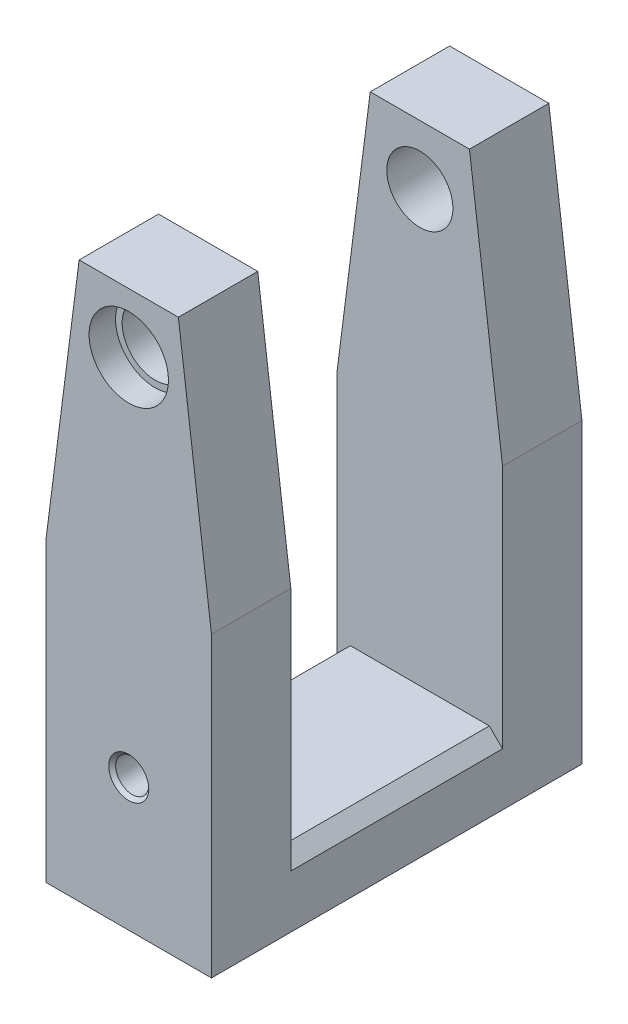
ISO-10303-21;
HEADER;
FILE_DESCRIPTION(('STEP AP214'),'2;1');
FILE_NAME('part.step','',(''),(''),'','','');
FILE_SCHEMA(('AUTOMOTIVE_DESIGN { 1 0 10303 214 1 1 1 1 }'));
ENDSEC;
DATA;
#1=APPLICATION_CONTEXT('core data for automotive mechanical design processes');
#2=APPLICATION_PROTOCOL_DEFINITION('international standard','automotive_design',2000,#1);
#3=PRODUCT_CONTEXT('',#1,'mechanical');
#4=PRODUCT('Part','Part','',(#3));
#5=PRODUCT_RELATED_PRODUCT_CATEGORY('part','',(#4));
#6=PRODUCT_DEFINITION_FORMATION('','',#4);
#7=PRODUCT_DEFINITION_CONTEXT('part definition',#1,'design');
#8=PRODUCT_DEFINITION('design','',#6,#7);
#9=PRODUCT_DEFINITION_SHAPE('','',#8);
#10=(LENGTH_UNIT() NAMED_UNIT(*) SI_UNIT(.MILLI.,.METRE.));
#11=(NAMED_UNIT(*) PLANE_ANGLE_UNIT() SI_UNIT($,.RADIAN.));
#12=(NAMED_UNIT(*) SI_UNIT($,.STERADIAN.) SOLID_ANGLE_UNIT());
#13=UNCERTAINTY_MEASURE_WITH_UNIT(LENGTH_MEASURE(1.E-05),#10,'distance_accuracy_value','');
#14=(GEOMETRIC_REPRESENTATION_CONTEXT(3) GLOBAL_UNCERTAINTY_ASSIGNED_CONTEXT((#13)) GLOBAL_UNIT_ASSIGNED_CONTEXT((#10,
#11,#12)) REPRESENTATION_CONTEXT('',''));
#15=CARTESIAN_POINT('',(0.,0.,0.));
#16=DIRECTION('',(0.,0.,1.));
#17=DIRECTION('',(1.,0.,0.));
#18=AXIS2_PLACEMENT_3D('',#15,#16,#17);
#19=CARTESIAN_POINT('',(12.5,3.,28.));
#20=DIRECTION('',(-0.991881664685851,-0.127164315985366,0.));
#21=DIRECTION('',(0.127164315985366,-0.991881664685851,0.));
#22=AXIS2_PLACEMENT_3D('',#19,#20,#21);
#23=PLANE('',#22);
#24=DIRECTION('',(0.,0.,-1.));
#25=VECTOR('',#24,1.);
#26=CARTESIAN_POINT('',(7.49999999999999,42.,28.));
#27=LINE('',#26,#25);
#28=CARTESIAN_POINT('',(7.5,42.,-16.));
#29=VERTEX_POINT('',#28);
#30=CARTESIAN_POINT('',(7.49999999999999,42.,-28.));
#31=VERTEX_POINT('',#30);
#32=EDGE_CURVE('E176',#29,#31,#27,.T.);
#33=ORIENTED_EDGE('',*,*,#32,.F.);
#34=DIRECTION('',(0.127164315985366,-0.991881664685851,0.));
#35=VECTOR('',#34,1.);
#36=CARTESIAN_POINT('',(12.5,3.00000000000001,-16.));
#37=LINE('',#36,#35);
#38=CARTESIAN_POINT('',(12.5,3.,-16.));
#39=VERTEX_POINT('',#38);
#40=EDGE_CURVE('E233',#29,#39,#37,.T.);
#41=ORIENTED_EDGE('',*,*,#40,.T.);
#42=DIRECTION('',(0.,0.,-1.));
#43=VECTOR('',#42,1.);
#44=CARTESIAN_POINT('',(12.5,3.,28.));
#45=LINE('',#44,#43);
#46=CARTESIAN_POINT('',(12.5,3.,-28.));
#47=VERTEX_POINT('',#46);
#48=EDGE_CURVE('E184',#39,#47,#45,.T.);
#49=ORIENTED_EDGE('',*,*,#48,.T.);
#50=DIRECTION('',(-0.127164315985366,0.99188166468585,0.));
#51=VECTOR('',#50,1.);
#52=CARTESIAN_POINT('',(12.5,3.,-28.));
#53=LINE('',#52,#51);
#54=EDGE_CURVE('E253',#47,#31,#53,.T.);
#55=ORIENTED_EDGE('',*,*,#54,.T.);
#56=EDGE_LOOP('',(#33,#41,#49,#55));
#57=FACE_BOUND('',#56,.T.);
#58=ADVANCED_FACE('F46',(#57),#23,.F.);
#59=CARTESIAN_POINT('',(-7.50000000000001,42.,28.));
#60=DIRECTION('',(0.,-1.,0.));
#61=DIRECTION('',(0.,0.,-1.));
#62=AXIS2_PLACEMENT_3D('',#59,#60,#61);
#63=PLANE('',#62);
#64=DIRECTION('',(0.,0.,-1.));
#65=VECTOR('',#64,1.);
#66=CARTESIAN_POINT('',(-7.50000000000001,42.,28.));
#67=LINE('',#66,#65);
#68=CARTESIAN_POINT('',(-7.5,42.,-16.));
#69=VERTEX_POINT('',#68);
#70=CARTESIAN_POINT('',(-7.50000000000001,42.,-28.));
#71=VERTEX_POINT('',#70);
#72=EDGE_CURVE('E177',#69,#71,#67,.T.);
#73=ORIENTED_EDGE('',*,*,#72,.F.);
#74=DIRECTION('',(1.,0.,0.));
#75=VECTOR('',#74,1.);
#76=CARTESIAN_POINT('',(-28.,42.,-16.));
#77=LINE('',#76,#75);
#78=EDGE_CURVE('E172',#69,#29,#77,.T.);
#79=ORIENTED_EDGE('',*,*,#78,.T.);
#80=ORIENTED_EDGE('',*,*,#32,.T.);
#81=DIRECTION('',(-1.,0.,0.));
#82=VECTOR('',#81,1.);
#83=CARTESIAN_POINT('',(-7.50000000000001,42.,-28.));
#84=LINE('',#83,#82);
#85=EDGE_CURVE('E256',#31,#71,#84,.T.);
#86=ORIENTED_EDGE('',*,*,#85,.T.);
#87=EDGE_LOOP('',(#73,#79,#80,#86));
#88=FACE_BOUND('',#87,.T.);
#89=ADVANCED_FACE('F296',(#88),#63,.F.);
#90=CARTESIAN_POINT('',(-12.5,3.,28.));
#91=DIRECTION('',(0.991881664685851,-0.127164315985365,0.));
#92=DIRECTION('',(0.127164315985365,0.991881664685851,0.));
#93=AXIS2_PLACEMENT_3D('',#90,#91,#92);
#94=PLANE('',#93);
#95=DIRECTION('',(0.,0.,-1.));
#96=VECTOR('',#95,1.);
#97=CARTESIAN_POINT('',(-12.5,3.,28.));
#98=LINE('',#97,#96);
#99=CARTESIAN_POINT('',(-12.5,3.,-16.));
#100=VERTEX_POINT('',#99);
#101=CARTESIAN_POINT('',(-12.5,3.,-28.));
#102=VERTEX_POINT('',#101);
#103=EDGE_CURVE('E268',#100,#102,#98,.T.);
#104=ORIENTED_EDGE('',*,*,#103,.F.);
#105=DIRECTION('',(0.127164315985365,0.991881664685851,0.));
#106=VECTOR('',#105,1.);
#107=CARTESIAN_POINT('',(-12.5,3.00000000000001,-16.));
#108=LINE('',#107,#106);
#109=EDGE_CURVE('E230',#100,#69,#108,.T.);
#110=ORIENTED_EDGE('',*,*,#109,.T.);
#111=ORIENTED_EDGE('',*,*,#72,.T.);
#112=DIRECTION('',(-0.127164315985365,-0.99188166468585,0.));
#113=VECTOR('',#112,1.);
#114=CARTESIAN_POINT('',(-12.5,3.,-28.));
#115=LINE('',#114,#113);
#116=EDGE_CURVE('E259',#71,#102,#115,.T.);
#117=ORIENTED_EDGE('',*,*,#116,.T.);
#118=EDGE_LOOP('',(#104,#110,#111,#117));
#119=FACE_BOUND('',#118,.T.);
#120=ADVANCED_FACE('F298',(#119),#94,.F.);
#121=CARTESIAN_POINT('',(12.5,3.,28.));
#122=DIRECTION('',(-1.,0.,0.));
#123=DIRECTION('',(0.,-1.,0.));
#124=AXIS2_PLACEMENT_3D('',#121,#122,#123);
#125=PLANE('',#124);
#126=DIRECTION('',(0.,0.,1.));
#127=VECTOR('',#126,1.);
#128=CARTESIAN_POINT('',(12.5,-34.,28.));
#129=LINE('',#128,#127);
#130=CARTESIAN_POINT('',(12.5,-34.,-16.));
#131=VERTEX_POINT('',#130);
#132=CARTESIAN_POINT('',(12.5,-34.,16.));
#133=VERTEX_POINT('',#132);
#134=EDGE_CURVE('E199',#131,#133,#129,.T.);
#135=ORIENTED_EDGE('',*,*,#134,.T.);
#136=DIRECTION('',(0.,1.,0.));
#137=VECTOR('',#136,1.);
#138=CARTESIAN_POINT('',(12.5,3.,16.));
#139=LINE('',#138,#137);
#140=CARTESIAN_POINT('',(12.5,3.,16.));
#141=VERTEX_POINT('',#140);
#142=EDGE_CURVE('E63',#133,#141,#139,.T.);
#143=ORIENTED_EDGE('',*,*,#142,.T.);
#144=CARTESIAN_POINT('',(12.5,3.,28.));
#145=VERTEX_POINT('',#144);
#146=EDGE_CURVE('E185',#145,#141,#45,.T.);
#147=ORIENTED_EDGE('',*,*,#146,.F.);
#148=DIRECTION('',(0.,1.,0.));
#149=VECTOR('',#148,1.);
#150=CARTESIAN_POINT('',(12.5,3.,28.));
#151=LINE('',#150,#149);
#152=CARTESIAN_POINT('',(12.5,-42.,28.));
#153=VERTEX_POINT('',#152);
#154=EDGE_CURVE('E237',#153,#145,#151,.T.);
#155=ORIENTED_EDGE('',*,*,#154,.F.);
#156=DIRECTION('',(0.,0.,-1.));
#157=VECTOR('',#156,1.);
#158=CARTESIAN_POINT('',(12.5,-42.,28.));
#159=LINE('',#158,#157);
#160=CARTESIAN_POINT('',(12.5,-42.,-28.));
#161=VERTEX_POINT('',#160);
#162=EDGE_CURVE('E250',#153,#161,#159,.T.);
#163=ORIENTED_EDGE('',*,*,#162,.T.);
#164=DIRECTION('',(0.,1.,0.));
#165=VECTOR('',#164,1.);
#166=CARTESIAN_POINT('',(12.5,3.,-28.));
#167=LINE('',#166,#165);
#168=EDGE_CURVE('E236',#161,#47,#167,.T.);
#169=ORIENTED_EDGE('',*,*,#168,.T.);
#170=ORIENTED_EDGE('',*,*,#48,.F.);
#171=DIRECTION('',(0.,-1.,0.));
#172=VECTOR('',#171,1.);
#173=CARTESIAN_POINT('',(12.5,3.00000000000001,-16.));
#174=LINE('',#173,#172);
#175=EDGE_CURVE('E71',#39,#131,#174,.T.);
#176=ORIENTED_EDGE('',*,*,#175,.T.);
#177=EDGE_LOOP('',(#135,#143,#147,#155,#163,#169,#170,#176));
#178=FACE_BOUND('',#177,.T.);
#179=ADVANCED_FACE('F284',(#178),#125,.F.);
#180=ORIENTED_EDGE('',*,*,#146,.T.);
#181=DIRECTION('',(-0.127164315985366,0.991881664685851,0.));
#182=VECTOR('',#181,1.);
#183=CARTESIAN_POINT('',(12.5,3.,16.));
#184=LINE('',#183,#182);
#185=CARTESIAN_POINT('',(7.5,42.,16.));
#186=VERTEX_POINT('',#185);
#187=EDGE_CURVE('E159',#141,#186,#184,.T.);
#188=ORIENTED_EDGE('',*,*,#187,.T.);
#189=CARTESIAN_POINT('',(7.49999999999999,42.,28.));
#190=VERTEX_POINT('',#189);
#191=EDGE_CURVE('E170',#190,#186,#27,.T.);
#192=ORIENTED_EDGE('',*,*,#191,.F.);
#193=DIRECTION('',(-0.127164315985366,0.99188166468585,0.));
#194=VECTOR('',#193,1.);
#195=CARTESIAN_POINT('',(12.5,3.,28.));
#196=LINE('',#195,#194);
#197=EDGE_CURVE('E240',#145,#190,#196,.T.);
#198=ORIENTED_EDGE('',*,*,#197,.F.);
#199=EDGE_LOOP('',(#180,#188,#192,#198));
#200=FACE_BOUND('',#199,.T.);
#201=ADVANCED_FACE('F283',(#200),#23,.F.);
#202=ORIENTED_EDGE('',*,*,#191,.T.);
#203=DIRECTION('',(1.,0.,0.));
#204=VECTOR('',#203,1.);
#205=CARTESIAN_POINT('',(-28.,42.,16.));
#206=LINE('',#205,#204);
#207=CARTESIAN_POINT('',(-7.5,42.,16.));
#208=VERTEX_POINT('',#207);
#209=EDGE_CURVE('E151',#208,#186,#206,.T.);
#210=ORIENTED_EDGE('',*,*,#209,.F.);
#211=CARTESIAN_POINT('',(-7.50000000000001,42.,28.));
#212=VERTEX_POINT('',#211);
#213=EDGE_CURVE('E167',#212,#208,#67,.T.);
#214=ORIENTED_EDGE('',*,*,#213,.F.);
#215=DIRECTION('',(-1.,0.,0.));
#216=VECTOR('',#215,1.);
#217=CARTESIAN_POINT('',(-7.50000000000001,42.,28.));
#218=LINE('',#217,#216);
#219=EDGE_CURVE('E243',#190,#212,#218,.T.);
#220=ORIENTED_EDGE('',*,*,#219,.F.);
#221=EDGE_LOOP('',(#202,#210,#214,#220));
#222=FACE_BOUND('',#221,.T.);
#223=ADVANCED_FACE('F165',(#222),#63,.F.);
#224=ORIENTED_EDGE('',*,*,#213,.T.);
#225=DIRECTION('',(-0.127164315985365,-0.991881664685851,0.));
#226=VECTOR('',#225,1.);
#227=CARTESIAN_POINT('',(-12.5,3.,16.));
#228=LINE('',#227,#226);
#229=CARTESIAN_POINT('',(-12.5,3.,16.));
#230=VERTEX_POINT('',#229);
#231=EDGE_CURVE('E147',#208,#230,#228,.T.);
#232=ORIENTED_EDGE('',*,*,#231,.T.);
#233=CARTESIAN_POINT('',(-12.5,3.,28.));
#234=VERTEX_POINT('',#233);
#235=EDGE_CURVE('E180',#234,#230,#98,.T.);
#236=ORIENTED_EDGE('',*,*,#235,.F.);
#237=DIRECTION('',(-0.127164315985365,-0.99188166468585,0.));
#238=VECTOR('',#237,1.);
#239=CARTESIAN_POINT('',(-12.5,3.,28.));
#240=LINE('',#239,#238);
#241=EDGE_CURVE('E175',#212,#234,#240,.T.);
#242=ORIENTED_EDGE('',*,*,#241,.F.);
#243=EDGE_LOOP('',(#224,#232,#236,#242));
#244=FACE_BOUND('',#243,.T.);
#245=ADVANCED_FACE('F174',(#244),#94,.F.);
#246=CARTESIAN_POINT('',(-12.5,3.,28.));
#247=DIRECTION('',(1.,0.,0.));
#248=DIRECTION('',(0.,1.,0.));
#249=AXIS2_PLACEMENT_3D('',#246,#247,#248);
#250=PLANE('',#249);
#251=DIRECTION('',(0.,0.,-1.));
#252=VECTOR('',#251,1.);
#253=CARTESIAN_POINT('',(-12.5,-34.,28.));
#254=LINE('',#253,#252);
#255=CARTESIAN_POINT('',(-12.5,-34.,16.));
#256=VERTEX_POINT('',#255);
#257=CARTESIAN_POINT('',(-12.5,-34.,-16.));
#258=VERTEX_POINT('',#257);
#259=EDGE_CURVE('E192',#256,#258,#254,.T.);
#260=ORIENTED_EDGE('',*,*,#259,.T.);
#261=DIRECTION('',(0.,1.,0.));
#262=VECTOR('',#261,1.);
#263=CARTESIAN_POINT('',(-12.5,3.00000000000001,-16.));
#264=LINE('',#263,#262);
#265=EDGE_CURVE('E189',#258,#100,#264,.T.);
#266=ORIENTED_EDGE('',*,*,#265,.T.);
#267=ORIENTED_EDGE('',*,*,#103,.T.);
#268=DIRECTION('',(0.,-1.,0.));
#269=VECTOR('',#268,1.);
#270=CARTESIAN_POINT('',(-12.5,3.,-28.));
#271=LINE('',#270,#269);
#272=CARTESIAN_POINT('',(-12.5,-42.,-28.));
#273=VERTEX_POINT('',#272);
#274=EDGE_CURVE('E262',#102,#273,#271,.T.);
#275=ORIENTED_EDGE('',*,*,#274,.T.);
#276=DIRECTION('',(0.,0.,-1.));
#277=VECTOR('',#276,1.);
#278=CARTESIAN_POINT('',(-12.5,-42.,28.));
#279=LINE('',#278,#277);
#280=CARTESIAN_POINT('',(-12.5,-42.,28.));
#281=VERTEX_POINT('',#280);
#282=EDGE_CURVE('E266',#281,#273,#279,.T.);
#283=ORIENTED_EDGE('',*,*,#282,.F.);
#284=DIRECTION('',(0.,-1.,0.));
#285=VECTOR('',#284,1.);
#286=CARTESIAN_POINT('',(-12.5,3.,28.));
#287=LINE('',#286,#285);
#288=EDGE_CURVE('E246',#234,#281,#287,.T.);
#289=ORIENTED_EDGE('',*,*,#288,.F.);
#290=ORIENTED_EDGE('',*,*,#235,.T.);
#291=DIRECTION('',(0.,-1.,0.));
#292=VECTOR('',#291,1.);
#293=CARTESIAN_POINT('',(-12.5,3.,16.));
#294=LINE('',#293,#292);
#295=EDGE_CURVE('E154',#230,#256,#294,.T.);
#296=ORIENTED_EDGE('',*,*,#295,.T.);
#297=EDGE_LOOP('',(#260,#266,#267,#275,#283,#289,#290,#296));
#298=FACE_BOUND('',#297,.T.);
#299=ADVANCED_FACE('F276',(#298),#250,.F.);
#300=CARTESIAN_POINT('',(-12.5,-42.,28.));
#301=DIRECTION('',(0.,1.,0.));
#302=DIRECTION('',(-1.,0.,0.));
#303=AXIS2_PLACEMENT_3D('',#300,#301,#302);
#304=PLANE('',#303);
#305=DIRECTION('',(1.,0.,0.));
#306=VECTOR('',#305,1.);
#307=CARTESIAN_POINT('',(-12.5,-42.,-28.));
#308=LINE('',#307,#306);
#309=EDGE_CURVE('E241',#273,#161,#308,.T.);
#310=ORIENTED_EDGE('',*,*,#309,.T.);
#311=ORIENTED_EDGE('',*,*,#162,.F.);
#312=DIRECTION('',(1.,0.,0.));
#313=VECTOR('',#312,1.);
#314=CARTESIAN_POINT('',(-12.5,-42.,28.));
#315=LINE('',#314,#313);
#316=EDGE_CURVE('E248',#281,#153,#315,.T.);
#317=ORIENTED_EDGE('',*,*,#316,.F.);
#318=ORIENTED_EDGE('',*,*,#282,.T.);
#319=EDGE_LOOP('',(#310,#311,#317,#318));
#320=FACE_BOUND('',#319,.T.);
#321=ADVANCED_FACE('F334',(#320),#304,.F.);
#322=CARTESIAN_POINT('',(0.,0.,28.));
#323=DIRECTION('',(0.,0.,1.));
#324=DIRECTION('',(1.,0.,0.));
#325=AXIS2_PLACEMENT_3D('',#322,#323,#324);
#326=PLANE('',#325);
#327=CARTESIAN_POINT('',(0.,-22.,28.));
#328=DIRECTION('',(0.,0.,1.));
#329=DIRECTION('',(1.,0.,0.));
#330=AXIS2_PLACEMENT_3D('',#327,#328,#329);
#331=CIRCLE('',#330,3.025);
#332=CARTESIAN_POINT('',(3.025,-22.,28.));
#333=VERTEX_POINT('',#332);
#334=EDGE_CURVE('E389',#333,#333,#331,.T.);
#335=ORIENTED_EDGE('',*,*,#334,.F.);
#336=EDGE_LOOP('',(#335));
#337=FACE_BOUND('',#336,.T.);
#338=CARTESIAN_POINT('',(0.,33.,28.));
#339=DIRECTION('',(0.,0.,1.));
#340=DIRECTION('',(1.,0.,0.));
#341=AXIS2_PLACEMENT_3D('',#338,#339,#340);
#342=CIRCLE('',#341,6.00000000000001);
#343=CARTESIAN_POINT('',(6.00000000000001,33.,28.));
#344=VERTEX_POINT('',#343);
#345=EDGE_CURVE('E405',#344,#344,#342,.T.);
#346=ORIENTED_EDGE('',*,*,#345,.F.);
#347=EDGE_LOOP('',(#346));
#348=FACE_BOUND('',#347,.T.);
#349=ORIENTED_EDGE('',*,*,#154,.T.);
#350=ORIENTED_EDGE('',*,*,#197,.T.);
#351=ORIENTED_EDGE('',*,*,#219,.T.);
#352=ORIENTED_EDGE('',*,*,#241,.T.);
#353=ORIENTED_EDGE('',*,*,#288,.T.);
#354=ORIENTED_EDGE('',*,*,#316,.T.);
#355=EDGE_LOOP('',(#349,#350,#351,#352,#353,#354));
#356=FACE_BOUND('',#355,.T.);
#357=ADVANCED_FACE('F278',(#337,#348,#356),#326,.T.);
#358=CARTESIAN_POINT('',(0.,0.,-28.));
#359=DIRECTION('',(0.,0.,1.));
#360=DIRECTION('',(1.,0.,0.));
#361=AXIS2_PLACEMENT_3D('',#358,#359,#360);
#362=PLANE('',#361);
#363=CARTESIAN_POINT('',(0.,33.,-28.));
#364=DIRECTION('',(0.,0.,-1.));
#365=DIRECTION('',(-1.,0.,0.));
#366=AXIS2_PLACEMENT_3D('',#363,#364,#365);
#367=CIRCLE('',#366,6.00000000000001);
#368=CARTESIAN_POINT('',(-6.00000000000002,33.,-28.));
#369=VERTEX_POINT('',#368);
#370=EDGE_CURVE('E393',#369,#369,#367,.T.);
#371=ORIENTED_EDGE('',*,*,#370,.F.);
#372=EDGE_LOOP('',(#371));
#373=FACE_BOUND('',#372,.T.);
#374=ORIENTED_EDGE('',*,*,#168,.F.);
#375=ORIENTED_EDGE('',*,*,#309,.F.);
#376=ORIENTED_EDGE('',*,*,#274,.F.);
#377=ORIENTED_EDGE('',*,*,#116,.F.);
#378=ORIENTED_EDGE('',*,*,#85,.F.);
#379=ORIENTED_EDGE('',*,*,#54,.F.);
#380=EDGE_LOOP('',(#374,#375,#376,#377,#378,#379));
#381=FACE_BOUND('',#380,.T.);
#382=ADVANCED_FACE('F288',(#373,#381),#362,.F.);
#383=CARTESIAN_POINT('',(-28.,42.,-16.));
#384=DIRECTION('',(0.,0.,-1.));
#385=DIRECTION('',(0.,1.,0.));
#386=AXIS2_PLACEMENT_3D('',#383,#384,#385);
#387=PLANE('',#386);
#388=CARTESIAN_POINT('',(0.,33.,-16.));
#389=DIRECTION('',(0.,0.,-1.));
#390=DIRECTION('',(-1.,0.,0.));
#391=AXIS2_PLACEMENT_3D('',#388,#389,#390);
#392=CIRCLE('',#391,5.00000000000001);
#393=CARTESIAN_POINT('',(-5.00000000000002,33.,-16.));
#394=VERTEX_POINT('',#393);
#395=EDGE_CURVE('E402',#394,#394,#392,.T.);
#396=ORIENTED_EDGE('',*,*,#395,.T.);
#397=EDGE_LOOP('',(#396));
#398=FACE_BOUND('',#397,.T.);
#399=ORIENTED_EDGE('',*,*,#40,.F.);
#400=ORIENTED_EDGE('',*,*,#78,.F.);
#401=ORIENTED_EDGE('',*,*,#109,.F.);
#402=ORIENTED_EDGE('',*,*,#265,.F.);
#403=DIRECTION('',(-0.707106781186547,-0.707106781186548,0.));
#404=VECTOR('',#403,1.);
#405=CARTESIAN_POINT('',(17.75,-3.74999999999995,-16.));
#406=LINE('',#405,#404);
#407=CARTESIAN_POINT('',(-10.5,-32.,-16.));
#408=VERTEX_POINT('',#407);
#409=EDGE_CURVE('E201',#258,#408,#406,.F.);
#410=ORIENTED_EDGE('',*,*,#409,.T.);
#411=DIRECTION('',(1.,0.,0.));
#412=VECTOR('',#411,1.);
#413=CARTESIAN_POINT('',(-28.,-32.,-16.));
#414=LINE('',#413,#412);
#415=CARTESIAN_POINT('',(10.5,-32.,-16.));
#416=VERTEX_POINT('',#415);
#417=EDGE_CURVE('E160',#408,#416,#414,.T.);
#418=ORIENTED_EDGE('',*,*,#417,.T.);
#419=DIRECTION('',(-0.707106781186547,0.707106781186548,0.));
#420=VECTOR('',#419,1.);
#421=CARTESIAN_POINT('',(-45.75,24.2500000000001,-16.));
#422=LINE('',#421,#420);
#423=EDGE_CURVE('E11',#416,#131,#422,.F.);
#424=ORIENTED_EDGE('',*,*,#423,.T.);
#425=ORIENTED_EDGE('',*,*,#175,.F.);
#426=EDGE_LOOP('',(#399,#400,#401,#402,#410,#418,#424,#425));
#427=FACE_BOUND('',#426,.T.);
#428=ADVANCED_FACE('F218',(#398,#427),#387,.F.);
#429=CARTESIAN_POINT('',(-28.,-32.,16.));
#430=DIRECTION('',(0.,-1.,0.));
#431=DIRECTION('',(0.,0.,-1.));
#432=AXIS2_PLACEMENT_3D('',#429,#430,#431);
#433=PLANE('',#432);
#434=ORIENTED_EDGE('',*,*,#417,.F.);
#435=DIRECTION('',(0.,0.,1.));
#436=VECTOR('',#435,1.);
#437=CARTESIAN_POINT('',(-10.5,-32.,16.));
#438=LINE('',#437,#436);
#439=CARTESIAN_POINT('',(-10.5,-32.,16.));
#440=VERTEX_POINT('',#439);
#441=EDGE_CURVE('E197',#408,#440,#438,.T.);
#442=ORIENTED_EDGE('',*,*,#441,.T.);
#443=DIRECTION('',(1.,0.,0.));
#444=VECTOR('',#443,1.);
#445=CARTESIAN_POINT('',(-28.,-32.,16.));
#446=LINE('',#445,#444);
#447=CARTESIAN_POINT('',(10.5,-32.,16.));
#448=VERTEX_POINT('',#447);
#449=EDGE_CURVE('E171',#440,#448,#446,.T.);
#450=ORIENTED_EDGE('',*,*,#449,.T.);
#451=DIRECTION('',(0.,0.,-1.));
#452=VECTOR('',#451,1.);
#453=CARTESIAN_POINT('',(10.5,-32.,16.));
#454=LINE('',#453,#452);
#455=EDGE_CURVE('E195',#448,#416,#454,.T.);
#456=ORIENTED_EDGE('',*,*,#455,.T.);
#457=EDGE_LOOP('',(#434,#442,#450,#456));
#458=FACE_BOUND('',#457,.T.);
#459=ADVANCED_FACE('F212',(#458),#433,.F.);
#460=CARTESIAN_POINT('',(-28.,42.,16.));
#461=DIRECTION('',(0.,0.,1.));
#462=DIRECTION('',(0.,-1.,0.));
#463=AXIS2_PLACEMENT_3D('',#460,#461,#462);
#464=PLANE('',#463);
#465=CARTESIAN_POINT('',(0.,-22.,16.));
#466=DIRECTION('',(0.,0.,1.));
#467=DIRECTION('',(0.,-1.,0.));
#468=AXIS2_PLACEMENT_3D('',#465,#466,#467);
#469=CIRCLE('',#468,2.5);
#470=CARTESIAN_POINT('',(0.,-24.5,16.));
#471=VERTEX_POINT('',#470);
#472=EDGE_CURVE('E51',#471,#471,#469,.T.);
#473=ORIENTED_EDGE('',*,*,#472,.T.);
#474=EDGE_LOOP('',(#473));
#475=FACE_BOUND('',#474,.T.);
#476=CARTESIAN_POINT('',(0.,33.,16.));
#477=DIRECTION('',(0.,0.,1.));
#478=DIRECTION('',(1.,0.,0.));
#479=AXIS2_PLACEMENT_3D('',#476,#477,#478);
#480=CIRCLE('',#479,5.00000000000001);
#481=CARTESIAN_POINT('',(5.00000000000001,33.,16.));
#482=VERTEX_POINT('',#481);
#483=EDGE_CURVE('E223',#482,#482,#480,.T.);
#484=ORIENTED_EDGE('',*,*,#483,.T.);
#485=EDGE_LOOP('',(#484));
#486=FACE_BOUND('',#485,.T.);
#487=ORIENTED_EDGE('',*,*,#449,.F.);
#488=DIRECTION('',(0.707106781186547,0.707106781186548,0.));
#489=VECTOR('',#488,1.);
#490=CARTESIAN_POINT('',(17.75,-3.74999999999995,16.));
#491=LINE('',#490,#489);
#492=EDGE_CURVE('E203',#440,#256,#491,.F.);
#493=ORIENTED_EDGE('',*,*,#492,.T.);
#494=ORIENTED_EDGE('',*,*,#295,.F.);
#495=ORIENTED_EDGE('',*,*,#231,.F.);
#496=ORIENTED_EDGE('',*,*,#209,.T.);
#497=ORIENTED_EDGE('',*,*,#187,.F.);
#498=ORIENTED_EDGE('',*,*,#142,.F.);
#499=DIRECTION('',(0.707106781186547,-0.707106781186548,0.));
#500=VECTOR('',#499,1.);
#501=CARTESIAN_POINT('',(-45.75,24.2500000000001,16.));
#502=LINE('',#501,#500);
#503=EDGE_CURVE('E56',#133,#448,#502,.F.);
#504=ORIENTED_EDGE('',*,*,#503,.T.);
#505=EDGE_LOOP('',(#487,#493,#494,#495,#496,#497,#498,#504));
#506=FACE_BOUND('',#505,.T.);
#507=ADVANCED_FACE('F150',(#475,#486,#506),#464,.F.);
#508=CARTESIAN_POINT('',(-12.5,-34.,28.));
#509=DIRECTION('',(0.707106781186548,-0.707106781186547,0.));
#510=DIRECTION('',(0.,0.,-1.));
#511=AXIS2_PLACEMENT_3D('',#508,#509,#510);
#512=PLANE('',#511);
#513=ORIENTED_EDGE('',*,*,#492,.F.);
#514=ORIENTED_EDGE('',*,*,#441,.F.);
#515=ORIENTED_EDGE('',*,*,#409,.F.);
#516=ORIENTED_EDGE('',*,*,#259,.F.);
#517=EDGE_LOOP('',(#513,#514,#515,#516));
#518=FACE_BOUND('',#517,.T.);
#519=ADVANCED_FACE('F301',(#518),#512,.F.);
#520=CARTESIAN_POINT('',(12.5,-34.,28.));
#521=DIRECTION('',(-0.707106781186548,-0.707106781186547,0.));
#522=DIRECTION('',(0.,0.,1.));
#523=AXIS2_PLACEMENT_3D('',#520,#521,#522);
#524=PLANE('',#523);
#525=ORIENTED_EDGE('',*,*,#423,.F.);
#526=ORIENTED_EDGE('',*,*,#455,.F.);
#527=ORIENTED_EDGE('',*,*,#503,.F.);
#528=ORIENTED_EDGE('',*,*,#134,.F.);
#529=EDGE_LOOP('',(#525,#526,#527,#528));
#530=FACE_BOUND('',#529,.T.);
#531=ADVANCED_FACE('F49',(#530),#524,.F.);
#532=CARTESIAN_POINT('',(0.,33.,28.));
#533=DIRECTION('',(0.,0.,1.));
#534=DIRECTION('',(1.,0.,0.));
#535=AXIS2_PLACEMENT_3D('',#532,#533,#534);
#536=CYLINDRICAL_SURFACE('',#535,5.00000000000001);
#537=ORIENTED_EDGE('',*,*,#483,.F.);
#538=EDGE_LOOP('',(#537));
#539=FACE_BOUND('',#538,.T.);
#540=CARTESIAN_POINT('',(0.,33.,24.));
#541=DIRECTION('',(0.,0.,1.));
#542=DIRECTION('',(1.,0.,0.));
#543=AXIS2_PLACEMENT_3D('',#540,#541,#542);
#544=CIRCLE('',#543,5.00000000000001);
#545=CARTESIAN_POINT('',(5.00000000000001,33.,24.));
#546=VERTEX_POINT('',#545);
#547=EDGE_CURVE('E410',#546,#546,#544,.T.);
#548=ORIENTED_EDGE('',*,*,#547,.T.);
#549=EDGE_LOOP('',(#548));
#550=FACE_BOUND('',#549,.T.);
#551=ADVANCED_FACE('F307',(#539,#550),#536,.F.);
#552=CARTESIAN_POINT('',(5.00000000000001,33.,24.));
#553=DIRECTION('',(0.,0.,-1.));
#554=DIRECTION('',(-1.,0.,0.));
#555=AXIS2_PLACEMENT_3D('',#552,#553,#554);
#556=PLANE('',#555);
#557=ORIENTED_EDGE('',*,*,#547,.F.);
#558=EDGE_LOOP('',(#557));
#559=FACE_BOUND('',#558,.T.);
#560=CARTESIAN_POINT('',(0.,33.,24.));
#561=DIRECTION('',(0.,0.,1.));
#562=DIRECTION('',(1.,0.,0.));
#563=AXIS2_PLACEMENT_3D('',#560,#561,#562);
#564=CIRCLE('',#563,6.00000000000001);
#565=CARTESIAN_POINT('',(6.00000000000001,33.,24.));
#566=VERTEX_POINT('',#565);
#567=EDGE_CURVE('E408',#566,#566,#564,.T.);
#568=ORIENTED_EDGE('',*,*,#567,.T.);
#569=EDGE_LOOP('',(#568));
#570=FACE_BOUND('',#569,.T.);
#571=ADVANCED_FACE('F353',(#559,#570),#556,.F.);
#572=CARTESIAN_POINT('',(0.,33.,28.));
#573=DIRECTION('',(0.,0.,1.));
#574=DIRECTION('',(1.,0.,0.));
#575=AXIS2_PLACEMENT_3D('',#572,#573,#574);
#576=CYLINDRICAL_SURFACE('',#575,6.00000000000001);
#577=ORIENTED_EDGE('',*,*,#567,.F.);
#578=EDGE_LOOP('',(#577));
#579=FACE_BOUND('',#578,.T.);
#580=ORIENTED_EDGE('',*,*,#345,.T.);
#581=EDGE_LOOP('',(#580));
#582=FACE_BOUND('',#581,.T.);
#583=ADVANCED_FACE('F357',(#579,#582),#576,.F.);
#584=CARTESIAN_POINT('',(0.,33.,-28.));
#585=DIRECTION('',(0.,0.,-1.));
#586=DIRECTION('',(-1.,0.,0.));
#587=AXIS2_PLACEMENT_3D('',#584,#585,#586);
#588=CYLINDRICAL_SURFACE('',#587,5.00000000000001);
#589=ORIENTED_EDGE('',*,*,#395,.F.);
#590=EDGE_LOOP('',(#589));
#591=FACE_BOUND('',#590,.T.);
#592=CARTESIAN_POINT('',(0.,33.,-24.));
#593=DIRECTION('',(0.,0.,-1.));
#594=DIRECTION('',(-1.,0.,0.));
#595=AXIS2_PLACEMENT_3D('',#592,#593,#594);
#596=CIRCLE('',#595,5.00000000000001);
#597=CARTESIAN_POINT('',(-5.00000000000002,33.,-24.));
#598=VERTEX_POINT('',#597);
#599=EDGE_CURVE('E399',#598,#598,#596,.T.);
#600=ORIENTED_EDGE('',*,*,#599,.T.);
#601=EDGE_LOOP('',(#600));
#602=FACE_BOUND('',#601,.T.);
#603=ADVANCED_FACE('F361',(#591,#602),#588,.F.);
#604=CARTESIAN_POINT('',(5.00000000000001,33.,-24.));
#605=DIRECTION('',(0.,0.,1.));
#606=DIRECTION('',(1.,0.,0.));
#607=AXIS2_PLACEMENT_3D('',#604,#605,#606);
#608=PLANE('',#607);
#609=ORIENTED_EDGE('',*,*,#599,.F.);
#610=EDGE_LOOP('',(#609));
#611=FACE_BOUND('',#610,.T.);
#612=CARTESIAN_POINT('',(0.,33.,-24.));
#613=DIRECTION('',(0.,0.,-1.));
#614=DIRECTION('',(-1.,0.,0.));
#615=AXIS2_PLACEMENT_3D('',#612,#613,#614);
#616=CIRCLE('',#615,6.00000000000001);
#617=CARTESIAN_POINT('',(-6.00000000000002,33.,-24.));
#618=VERTEX_POINT('',#617);
#619=EDGE_CURVE('E396',#618,#618,#616,.T.);
#620=ORIENTED_EDGE('',*,*,#619,.T.);
#621=EDGE_LOOP('',(#620));
#622=FACE_BOUND('',#621,.T.);
#623=ADVANCED_FACE('F365',(#611,#622),#608,.F.);
#624=CARTESIAN_POINT('',(0.,33.,-28.));
#625=DIRECTION('',(0.,0.,-1.));
#626=DIRECTION('',(-1.,0.,0.));
#627=AXIS2_PLACEMENT_3D('',#624,#625,#626);
#628=CYLINDRICAL_SURFACE('',#627,6.00000000000001);
#629=ORIENTED_EDGE('',*,*,#619,.F.);
#630=EDGE_LOOP('',(#629));
#631=FACE_BOUND('',#630,.T.);
#632=ORIENTED_EDGE('',*,*,#370,.T.);
#633=EDGE_LOOP('',(#632));
#634=FACE_BOUND('',#633,.T.);
#635=ADVANCED_FACE('F369',(#631,#634),#628,.F.);
#636=CARTESIAN_POINT('',(0.,-22.,28.));
#637=DIRECTION('',(0.,0.,1.));
#638=DIRECTION('',(1.,0.,0.));
#639=AXIS2_PLACEMENT_3D('',#636,#637,#638);
#640=CYLINDRICAL_SURFACE('',#639,2.5);
#641=CARTESIAN_POINT('',(0.,-22.,27.475));
#642=DIRECTION('',(0.,0.,1.));
#643=DIRECTION('',(1.,0.,0.));
#644=AXIS2_PLACEMENT_3D('',#641,#642,#643);
#645=CIRCLE('',#644,2.5);
#646=CARTESIAN_POINT('',(2.5,-22.,27.475));
#647=VERTEX_POINT('',#646);
#648=EDGE_CURVE('E386',#647,#647,#645,.T.);
#649=ORIENTED_EDGE('',*,*,#648,.T.);
#650=EDGE_LOOP('',(#649));
#651=FACE_BOUND('',#650,.T.);
#652=ORIENTED_EDGE('',*,*,#472,.F.);
#653=EDGE_LOOP('',(#652));
#654=FACE_BOUND('',#653,.T.);
#655=ADVANCED_FACE('F373',(#651,#654),#640,.F.);
#656=CARTESIAN_POINT('',(0.,-22.,28.));
#657=DIRECTION('',(0.,0.,1.));
#658=DIRECTION('',(1.,0.,0.));
#659=AXIS2_PLACEMENT_3D('',#656,#657,#658);
#660=CONICAL_SURFACE('',#659,3.025,0.785398163397449);
#661=ORIENTED_EDGE('',*,*,#648,.F.);
#662=EDGE_LOOP('',(#661));
#663=FACE_BOUND('',#662,.T.);
#664=ORIENTED_EDGE('',*,*,#334,.T.);
#665=EDGE_LOOP('',(#664));
#666=FACE_BOUND('',#665,.T.);
#667=ADVANCED_FACE('F377',(#663,#666),#660,.F.);
#668=CLOSED_SHELL('',(#58,#89,#120,#179,#201,#223,#245,#299,#321,#357,#382,#428,#459,#507,#519,
#531,#551,#571,#583,#603,#623,#635,#655,#667));
#669=MANIFOLD_SOLID_BREP('B2',#668);
#670=ADVANCED_BREP_SHAPE_REPRESENTATION('',(#18,#669),#14);
#671=SHAPE_DEFINITION_REPRESENTATION(#9,#670);
ENDSEC;
END-ISO-10303-21;
